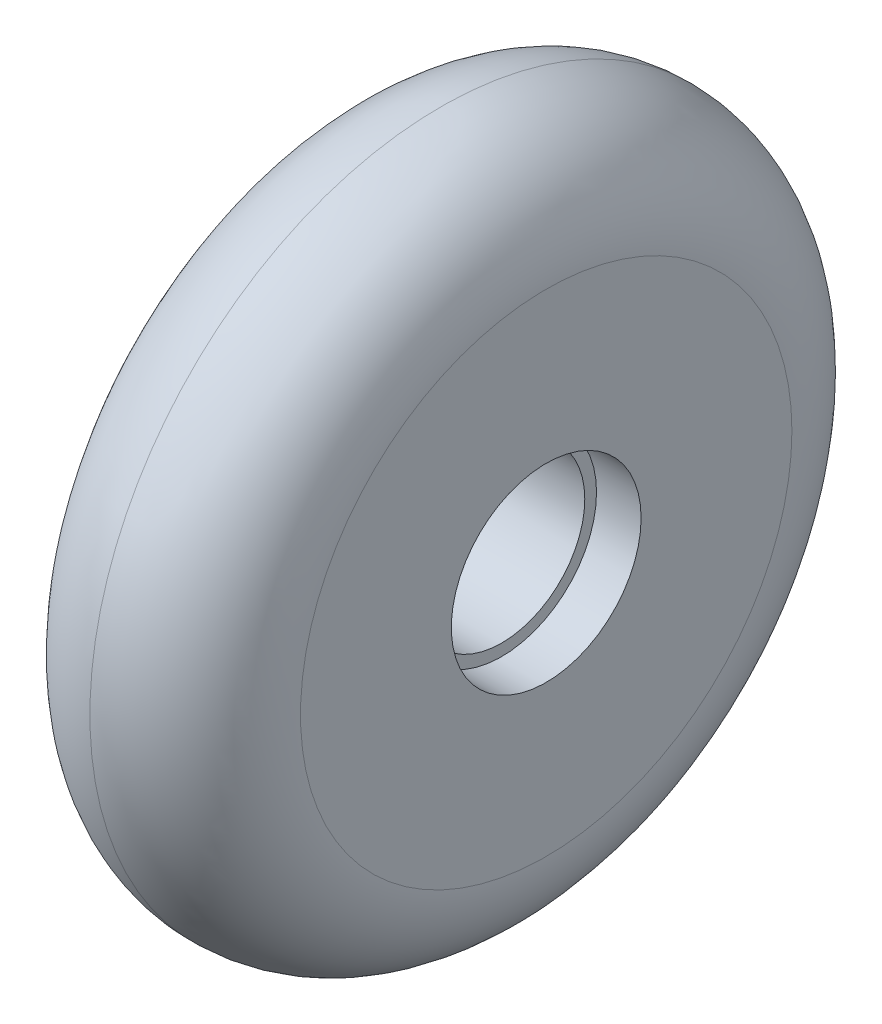
ISO-10303-21;
HEADER;
FILE_DESCRIPTION(('STEP AP214'),'2;1');
FILE_NAME('part.step','',(''),(''),'','','');
FILE_SCHEMA(('AUTOMOTIVE_DESIGN { 1 0 10303 214 1 1 1 1 }'));
ENDSEC;
DATA;
#1=APPLICATION_CONTEXT('core data for automotive mechanical design processes');
#2=APPLICATION_PROTOCOL_DEFINITION('international standard','automotive_design',2000,#1);
#3=PRODUCT_CONTEXT('',#1,'mechanical');
#4=PRODUCT('Part','Part','',(#3));
#5=PRODUCT_RELATED_PRODUCT_CATEGORY('part','',(#4));
#6=PRODUCT_DEFINITION_FORMATION('','',#4);
#7=PRODUCT_DEFINITION_CONTEXT('part definition',#1,'design');
#8=PRODUCT_DEFINITION('design','',#6,#7);
#9=PRODUCT_DEFINITION_SHAPE('','',#8);
#10=(LENGTH_UNIT() NAMED_UNIT(*) SI_UNIT(.MILLI.,.METRE.));
#11=(NAMED_UNIT(*) PLANE_ANGLE_UNIT() SI_UNIT($,.RADIAN.));
#12=(NAMED_UNIT(*) SI_UNIT($,.STERADIAN.) SOLID_ANGLE_UNIT());
#13=UNCERTAINTY_MEASURE_WITH_UNIT(LENGTH_MEASURE(1.E-05),#10,'distance_accuracy_value','');
#14=(GEOMETRIC_REPRESENTATION_CONTEXT(3) GLOBAL_UNCERTAINTY_ASSIGNED_CONTEXT((#13)) GLOBAL_UNIT_ASSIGNED_CONTEXT((#10,
#11,#12)) REPRESENTATION_CONTEXT('',''));
#15=CARTESIAN_POINT('',(0.,0.,0.));
#16=DIRECTION('',(0.,0.,1.));
#17=DIRECTION('',(1.,0.,0.));
#18=AXIS2_PLACEMENT_3D('',#15,#16,#17);
#19=CARTESIAN_POINT('',(24.,0.,0.));
#20=DIRECTION('',(-1.,0.,0.));
#21=DIRECTION('',(0.,0.,1.));
#22=AXIS2_PLACEMENT_3D('',#19,#20,#21);
#23=CYLINDRICAL_SURFACE('',#22,9.475);
#24=CARTESIAN_POINT('',(18.92,0.,0.));
#25=DIRECTION('',(1.,0.,0.));
#26=DIRECTION('',(0.,0.,-1.));
#27=AXIS2_PLACEMENT_3D('',#24,#25,#26);
#28=CIRCLE('',#27,9.475);
#29=CARTESIAN_POINT('',(18.92,0.,-9.475));
#30=VERTEX_POINT('',#29);
#31=EDGE_CURVE('E63',#30,#30,#28,.T.);
#32=ORIENTED_EDGE('',*,*,#31,.T.);
#33=EDGE_LOOP('',(#32));
#34=FACE_BOUND('',#33,.T.);
#35=CARTESIAN_POINT('',(5.08,0.,0.));
#36=DIRECTION('',(-1.,0.,0.));
#37=DIRECTION('',(0.,0.,1.));
#38=AXIS2_PLACEMENT_3D('',#35,#36,#37);
#39=CIRCLE('',#38,9.475);
#40=CARTESIAN_POINT('',(5.08,0.,9.475));
#41=VERTEX_POINT('',#40);
#42=EDGE_CURVE('E49',#41,#41,#39,.T.);
#43=ORIENTED_EDGE('',*,*,#42,.T.);
#44=EDGE_LOOP('',(#43));
#45=FACE_BOUND('',#44,.T.);
#46=ADVANCED_FACE('F45',(#34,#45),#23,.F.);
#47=CARTESIAN_POINT('',(24.,0.,0.));
#48=DIRECTION('',(1.,0.,0.));
#49=DIRECTION('',(0.,0.,-1.));
#50=AXIS2_PLACEMENT_3D('',#47,#48,#49);
#51=PLANE('',#50);
#52=CARTESIAN_POINT('',(24.,0.,0.));
#53=DIRECTION('',(1.,0.,0.));
#54=DIRECTION('',(0.,0.,-1.));
#55=AXIS2_PLACEMENT_3D('',#52,#53,#54);
#56=CIRCLE('',#55,10.815);
#57=CARTESIAN_POINT('',(24.,0.,-10.815));
#58=VERTEX_POINT('',#57);
#59=EDGE_CURVE('E69',#58,#58,#56,.T.);
#60=ORIENTED_EDGE('',*,*,#59,.F.);
#61=EDGE_LOOP('',(#60));
#62=FACE_BOUND('',#61,.T.);
#63=CARTESIAN_POINT('',(24.,0.,0.));
#64=DIRECTION('',(1.,0.,0.));
#65=DIRECTION('',(0.,0.,-1.));
#66=AXIS2_PLACEMENT_3D('',#63,#64,#65);
#67=CIRCLE('',#66,28.);
#68=CARTESIAN_POINT('',(24.,0.,-28.));
#69=VERTEX_POINT('',#68);
#70=EDGE_CURVE('E10',#69,#69,#67,.T.);
#71=ORIENTED_EDGE('',*,*,#70,.T.);
#72=EDGE_LOOP('',(#71));
#73=FACE_BOUND('',#72,.T.);
#74=ADVANCED_FACE('F97',(#62,#73),#51,.T.);
#75=CARTESIAN_POINT('',(0.,0.,0.));
#76=DIRECTION('',(1.,0.,0.));
#77=DIRECTION('',(0.,0.,-1.));
#78=AXIS2_PLACEMENT_3D('',#75,#76,#77);
#79=PLANE('',#78);
#80=CARTESIAN_POINT('',(0.,0.,0.));
#81=DIRECTION('',(-1.,0.,0.));
#82=DIRECTION('',(0.,0.,1.));
#83=AXIS2_PLACEMENT_3D('',#80,#81,#82);
#84=CIRCLE('',#83,10.815);
#85=CARTESIAN_POINT('',(0.,0.,10.815));
#86=VERTEX_POINT('',#85);
#87=EDGE_CURVE('E75',#86,#86,#84,.T.);
#88=ORIENTED_EDGE('',*,*,#87,.F.);
#89=EDGE_LOOP('',(#88));
#90=FACE_BOUND('',#89,.T.);
#91=CARTESIAN_POINT('',(0.,0.,0.));
#92=DIRECTION('',(1.,0.,0.));
#93=DIRECTION('',(0.,0.,-1.));
#94=AXIS2_PLACEMENT_3D('',#91,#92,#93);
#95=CIRCLE('',#94,28.);
#96=CARTESIAN_POINT('',(0.,0.,-28.));
#97=VERTEX_POINT('',#96);
#98=EDGE_CURVE('E53',#97,#97,#95,.F.);
#99=ORIENTED_EDGE('',*,*,#98,.T.);
#100=EDGE_LOOP('',(#99));
#101=FACE_BOUND('',#100,.T.);
#102=ADVANCED_FACE('F104',(#90,#101),#79,.F.);
#103=CARTESIAN_POINT('',(12.,0.,0.));
#104=DIRECTION('',(1.,0.,0.));
#105=DIRECTION('',(0.,0.,-1.));
#106=AXIS2_PLACEMENT_3D('',#103,#104,#105);
#107=TOROIDAL_SURFACE('',#106,28.,12.);
#108=ORIENTED_EDGE('',*,*,#70,.F.);
#109=EDGE_LOOP('',(#108));
#110=FACE_BOUND('',#109,.T.);
#111=CARTESIAN_POINT('',(12.,0.,0.));
#112=DIRECTION('',(1.,0.,0.));
#113=DIRECTION('',(0.,0.,-1.));
#114=AXIS2_PLACEMENT_3D('',#111,#112,#113);
#115=CIRCLE('',#114,40.);
#116=CARTESIAN_POINT('',(12.,0.,-40.));
#117=VERTEX_POINT('',#116);
#118=EDGE_CURVE('E58',#117,#117,#115,.F.);
#119=ORIENTED_EDGE('',*,*,#118,.F.);
#120=EDGE_LOOP('',(#119));
#121=FACE_BOUND('',#120,.T.);
#122=ADVANCED_FACE('F47',(#110,#121),#107,.T.);
#123=CARTESIAN_POINT('',(12.,0.,0.));
#124=DIRECTION('',(1.,0.,0.));
#125=DIRECTION('',(0.,0.,-1.));
#126=AXIS2_PLACEMENT_3D('',#123,#124,#125);
#127=TOROIDAL_SURFACE('',#126,28.,12.);
#128=ORIENTED_EDGE('',*,*,#98,.F.);
#129=EDGE_LOOP('',(#128));
#130=FACE_BOUND('',#129,.T.);
#131=ORIENTED_EDGE('',*,*,#118,.T.);
#132=EDGE_LOOP('',(#131));
#133=FACE_BOUND('',#132,.T.);
#134=ADVANCED_FACE('F113',(#130,#133),#127,.T.);
#135=CARTESIAN_POINT('',(18.92,0.,0.));
#136=DIRECTION('',(1.,0.,0.));
#137=DIRECTION('',(0.,0.,-1.));
#138=AXIS2_PLACEMENT_3D('',#135,#136,#137);
#139=CYLINDRICAL_SURFACE('',#138,10.815);
#140=CARTESIAN_POINT('',(18.92,0.,0.));
#141=DIRECTION('',(1.,0.,0.));
#142=DIRECTION('',(0.,0.,-1.));
#143=AXIS2_PLACEMENT_3D('',#140,#141,#142);
#144=CIRCLE('',#143,10.815);
#145=CARTESIAN_POINT('',(18.92,0.,-10.815));
#146=VERTEX_POINT('',#145);
#147=EDGE_CURVE('E65',#146,#146,#144,.T.);
#148=ORIENTED_EDGE('',*,*,#147,.F.);
#149=EDGE_LOOP('',(#148));
#150=FACE_BOUND('',#149,.T.);
#151=ORIENTED_EDGE('',*,*,#59,.T.);
#152=EDGE_LOOP('',(#151));
#153=FACE_BOUND('',#152,.T.);
#154=ADVANCED_FACE('F108',(#150,#153),#139,.F.);
#155=CARTESIAN_POINT('',(18.92,0.,0.));
#156=DIRECTION('',(1.,0.,0.));
#157=DIRECTION('',(0.,0.,-1.));
#158=AXIS2_PLACEMENT_3D('',#155,#156,#157);
#159=PLANE('',#158);
#160=ORIENTED_EDGE('',*,*,#31,.F.);
#161=EDGE_LOOP('',(#160));
#162=FACE_BOUND('',#161,.T.);
#163=ORIENTED_EDGE('',*,*,#147,.T.);
#164=EDGE_LOOP('',(#163));
#165=FACE_BOUND('',#164,.T.);
#166=ADVANCED_FACE('F93',(#162,#165),#159,.T.);
#167=CARTESIAN_POINT('',(5.08,0.,0.));
#168=DIRECTION('',(-1.,0.,0.));
#169=DIRECTION('',(0.,0.,1.));
#170=AXIS2_PLACEMENT_3D('',#167,#168,#169);
#171=CYLINDRICAL_SURFACE('',#170,10.815);
#172=CARTESIAN_POINT('',(5.08,0.,0.));
#173=DIRECTION('',(-1.,0.,0.));
#174=DIRECTION('',(0.,0.,1.));
#175=AXIS2_PLACEMENT_3D('',#172,#173,#174);
#176=CIRCLE('',#175,10.815);
#177=CARTESIAN_POINT('',(5.08,0.,10.815));
#178=VERTEX_POINT('',#177);
#179=EDGE_CURVE('E78',#178,#178,#176,.T.);
#180=ORIENTED_EDGE('',*,*,#179,.F.);
#181=EDGE_LOOP('',(#180));
#182=FACE_BOUND('',#181,.T.);
#183=ORIENTED_EDGE('',*,*,#87,.T.);
#184=EDGE_LOOP('',(#183));
#185=FACE_BOUND('',#184,.T.);
#186=ADVANCED_FACE('F88',(#182,#185),#171,.F.);
#187=CARTESIAN_POINT('',(5.08,0.,0.));
#188=DIRECTION('',(-1.,0.,0.));
#189=DIRECTION('',(0.,0.,1.));
#190=AXIS2_PLACEMENT_3D('',#187,#188,#189);
#191=PLANE('',#190);
#192=ORIENTED_EDGE('',*,*,#42,.F.);
#193=EDGE_LOOP('',(#192));
#194=FACE_BOUND('',#193,.T.);
#195=ORIENTED_EDGE('',*,*,#179,.T.);
#196=EDGE_LOOP('',(#195));
#197=FACE_BOUND('',#196,.T.);
#198=ADVANCED_FACE('F86',(#194,#197),#191,.T.);
#199=CLOSED_SHELL('',(#46,#74,#102,#122,#134,#154,#166,#186,#198));
#200=MANIFOLD_SOLID_BREP('B2',#199);
#201=ADVANCED_BREP_SHAPE_REPRESENTATION('',(#18,#200),#14);
#202=SHAPE_DEFINITION_REPRESENTATION(#9,#201);
ENDSEC;
END-ISO-10303-21;
